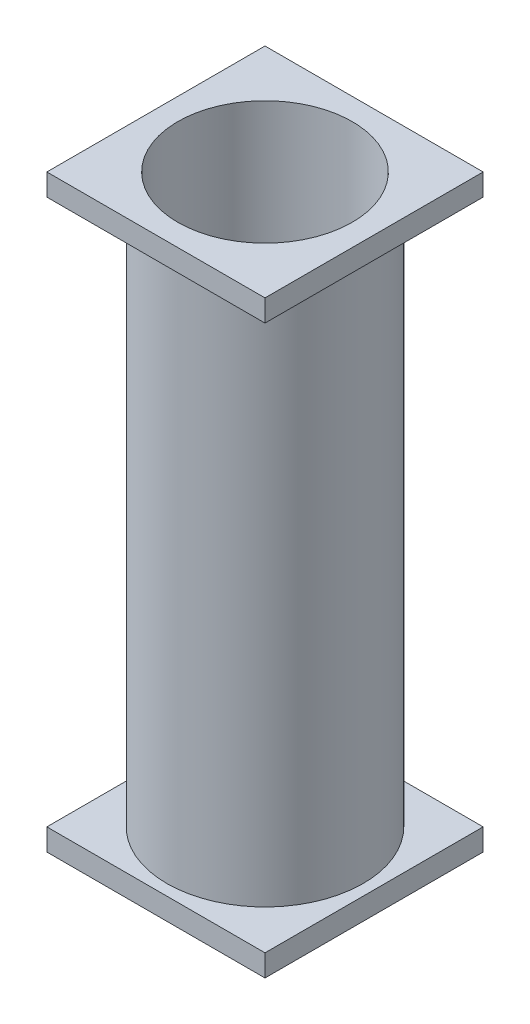
ISO-10303-21;
HEADER;
FILE_DESCRIPTION(('STEP AP214'),'2;1');
FILE_NAME('part.step','',(''),(''),'','','');
FILE_SCHEMA(('AUTOMOTIVE_DESIGN { 1 0 10303 214 1 1 1 1 }'));
ENDSEC;
DATA;
#1=APPLICATION_CONTEXT('core data for automotive mechanical design processes');
#2=APPLICATION_PROTOCOL_DEFINITION('international standard','automotive_design',2000,#1);
#3=PRODUCT_CONTEXT('',#1,'mechanical');
#4=PRODUCT('Part','Part','',(#3));
#5=PRODUCT_RELATED_PRODUCT_CATEGORY('part','',(#4));
#6=PRODUCT_DEFINITION_FORMATION('','',#4);
#7=PRODUCT_DEFINITION_CONTEXT('part definition',#1,'design');
#8=PRODUCT_DEFINITION('design','',#6,#7);
#9=PRODUCT_DEFINITION_SHAPE('','',#8);
#10=(LENGTH_UNIT() NAMED_UNIT(*) SI_UNIT(.MILLI.,.METRE.));
#11=(NAMED_UNIT(*) PLANE_ANGLE_UNIT() SI_UNIT($,.RADIAN.));
#12=(NAMED_UNIT(*) SI_UNIT($,.STERADIAN.) SOLID_ANGLE_UNIT());
#13=UNCERTAINTY_MEASURE_WITH_UNIT(LENGTH_MEASURE(1.E-05),#10,'distance_accuracy_value','');
#14=(GEOMETRIC_REPRESENTATION_CONTEXT(3) GLOBAL_UNCERTAINTY_ASSIGNED_CONTEXT((#13)) GLOBAL_UNIT_ASSIGNED_CONTEXT((#10,
#11,#12)) REPRESENTATION_CONTEXT('',''));
#15=CARTESIAN_POINT('',(0.,0.,0.));
#16=DIRECTION('',(0.,0.,1.));
#17=DIRECTION('',(1.,0.,0.));
#18=AXIS2_PLACEMENT_3D('',#15,#16,#17);
#19=CARTESIAN_POINT('',(0.,2.,0.));
#20=DIRECTION('',(0.,1.,0.));
#21=DIRECTION('',(0.,0.,1.));
#22=AXIS2_PLACEMENT_3D('',#19,#20,#21);
#23=PLANE('',#22);
#24=CARTESIAN_POINT('',(-10.,2.,-10.));
#25=DIRECTION('',(0.,1.,0.));
#26=DIRECTION('',(0.,0.,1.));
#27=AXIS2_PLACEMENT_3D('',#24,#25,#26);
#28=CIRCLE('',#27,9.);
#29=CARTESIAN_POINT('',(-10.,2.,-0.999999999999999));
#30=VERTEX_POINT('',#29);
#31=EDGE_CURVE('E147',#30,#30,#28,.T.);
#32=ORIENTED_EDGE('',*,*,#31,.F.);
#33=EDGE_LOOP('',(#32));
#34=FACE_BOUND('',#33,.T.);
#35=DIRECTION('',(0.,0.,-1.));
#36=VECTOR('',#35,1.);
#37=CARTESIAN_POINT('',(0.,2.,0.));
#38=LINE('',#37,#36);
#39=CARTESIAN_POINT('',(0.,2.,0.));
#40=VERTEX_POINT('',#39);
#41=CARTESIAN_POINT('',(0.,2.,-20.));
#42=VERTEX_POINT('',#41);
#43=EDGE_CURVE('E166',#40,#42,#38,.T.);
#44=ORIENTED_EDGE('',*,*,#43,.T.);
#45=DIRECTION('',(-1.,0.,0.));
#46=VECTOR('',#45,1.);
#47=CARTESIAN_POINT('',(0.,2.,-20.));
#48=LINE('',#47,#46);
#49=CARTESIAN_POINT('',(-20.,2.,-20.));
#50=VERTEX_POINT('',#49);
#51=EDGE_CURVE('E91',#42,#50,#48,.T.);
#52=ORIENTED_EDGE('',*,*,#51,.T.);
#53=DIRECTION('',(0.,0.,1.));
#54=VECTOR('',#53,1.);
#55=CARTESIAN_POINT('',(-20.,2.,0.));
#56=LINE('',#55,#54);
#57=CARTESIAN_POINT('',(-20.,2.,0.));
#58=VERTEX_POINT('',#57);
#59=EDGE_CURVE('E171',#50,#58,#56,.T.);
#60=ORIENTED_EDGE('',*,*,#59,.T.);
#61=DIRECTION('',(1.,0.,0.));
#62=VECTOR('',#61,1.);
#63=CARTESIAN_POINT('',(0.,2.,0.));
#64=LINE('',#63,#62);
#65=EDGE_CURVE('E60',#58,#40,#64,.T.);
#66=ORIENTED_EDGE('',*,*,#65,.T.);
#67=EDGE_LOOP('',(#44,#52,#60,#66));
#68=FACE_BOUND('',#67,.T.);
#69=ADVANCED_FACE('F42',(#34,#68),#23,.T.);
#70=CARTESIAN_POINT('',(0.,0.,0.));
#71=DIRECTION('',(0.,1.,0.));
#72=DIRECTION('',(0.,0.,1.));
#73=AXIS2_PLACEMENT_3D('',#70,#71,#72);
#74=PLANE('',#73);
#75=DIRECTION('',(0.,0.,-1.));
#76=VECTOR('',#75,1.);
#77=CARTESIAN_POINT('',(0.,0.,0.));
#78=LINE('',#77,#76);
#79=CARTESIAN_POINT('',(0.,0.,0.));
#80=VERTEX_POINT('',#79);
#81=CARTESIAN_POINT('',(0.,0.,-20.));
#82=VERTEX_POINT('',#81);
#83=EDGE_CURVE('E165',#80,#82,#78,.T.);
#84=ORIENTED_EDGE('',*,*,#83,.F.);
#85=DIRECTION('',(1.,0.,0.));
#86=VECTOR('',#85,1.);
#87=CARTESIAN_POINT('',(0.,0.,0.));
#88=LINE('',#87,#86);
#89=CARTESIAN_POINT('',(-20.,0.,0.));
#90=VERTEX_POINT('',#89);
#91=EDGE_CURVE('E84',#90,#80,#88,.T.);
#92=ORIENTED_EDGE('',*,*,#91,.F.);
#93=DIRECTION('',(0.,0.,1.));
#94=VECTOR('',#93,1.);
#95=CARTESIAN_POINT('',(-20.,0.,0.));
#96=LINE('',#95,#94);
#97=CARTESIAN_POINT('',(-20.,0.,-20.));
#98=VERTEX_POINT('',#97);
#99=EDGE_CURVE('E78',#98,#90,#96,.T.);
#100=ORIENTED_EDGE('',*,*,#99,.F.);
#101=DIRECTION('',(-1.,0.,0.));
#102=VECTOR('',#101,1.);
#103=CARTESIAN_POINT('',(0.,0.,-20.));
#104=LINE('',#103,#102);
#105=EDGE_CURVE('E180',#82,#98,#104,.T.);
#106=ORIENTED_EDGE('',*,*,#105,.F.);
#107=EDGE_LOOP('',(#84,#92,#100,#106));
#108=FACE_BOUND('',#107,.T.);
#109=CARTESIAN_POINT('',(-10.,0.,-10.));
#110=DIRECTION('',(0.,1.,0.));
#111=DIRECTION('',(0.,0.,1.));
#112=AXIS2_PLACEMENT_3D('',#109,#110,#111);
#113=CIRCLE('',#112,8.);
#114=CARTESIAN_POINT('',(-10.,0.,-2.));
#115=VERTEX_POINT('',#114);
#116=EDGE_CURVE('E160',#115,#115,#113,.T.);
#117=ORIENTED_EDGE('',*,*,#116,.T.);
#118=EDGE_LOOP('',(#117));
#119=FACE_BOUND('',#118,.T.);
#120=ADVANCED_FACE('F196',(#108,#119),#74,.F.);
#121=CARTESIAN_POINT('',(0.,2.,0.));
#122=DIRECTION('',(-1.,0.,0.));
#123=DIRECTION('',(0.,0.,1.));
#124=AXIS2_PLACEMENT_3D('',#121,#122,#123);
#125=PLANE('',#124);
#126=ORIENTED_EDGE('',*,*,#83,.T.);
#127=DIRECTION('',(0.,-1.,0.));
#128=VECTOR('',#127,1.);
#129=CARTESIAN_POINT('',(0.,2.,-20.));
#130=LINE('',#129,#128);
#131=EDGE_CURVE('E11',#42,#82,#130,.T.);
#132=ORIENTED_EDGE('',*,*,#131,.F.);
#133=ORIENTED_EDGE('',*,*,#43,.F.);
#134=DIRECTION('',(0.,-1.,0.));
#135=VECTOR('',#134,1.);
#136=CARTESIAN_POINT('',(0.,2.,0.));
#137=LINE('',#136,#135);
#138=EDGE_CURVE('E176',#40,#80,#137,.T.);
#139=ORIENTED_EDGE('',*,*,#138,.T.);
#140=EDGE_LOOP('',(#126,#132,#133,#139));
#141=FACE_BOUND('',#140,.T.);
#142=ADVANCED_FACE('F44',(#141),#125,.F.);
#143=CARTESIAN_POINT('',(0.,2.,-20.));
#144=DIRECTION('',(0.,0.,1.));
#145=DIRECTION('',(1.,0.,0.));
#146=AXIS2_PLACEMENT_3D('',#143,#144,#145);
#147=PLANE('',#146);
#148=ORIENTED_EDGE('',*,*,#105,.T.);
#149=DIRECTION('',(0.,-1.,0.));
#150=VECTOR('',#149,1.);
#151=CARTESIAN_POINT('',(-20.,2.,-20.));
#152=LINE('',#151,#150);
#153=EDGE_CURVE('E52',#50,#98,#152,.T.);
#154=ORIENTED_EDGE('',*,*,#153,.F.);
#155=ORIENTED_EDGE('',*,*,#51,.F.);
#156=ORIENTED_EDGE('',*,*,#131,.T.);
#157=EDGE_LOOP('',(#148,#154,#155,#156));
#158=FACE_BOUND('',#157,.T.);
#159=ADVANCED_FACE('F212',(#158),#147,.F.);
#160=CARTESIAN_POINT('',(-20.,2.,0.));
#161=DIRECTION('',(1.,0.,0.));
#162=DIRECTION('',(0.,0.,-1.));
#163=AXIS2_PLACEMENT_3D('',#160,#161,#162);
#164=PLANE('',#163);
#165=ORIENTED_EDGE('',*,*,#99,.T.);
#166=DIRECTION('',(0.,-1.,0.));
#167=VECTOR('',#166,1.);
#168=CARTESIAN_POINT('',(-20.,2.,0.));
#169=LINE('',#168,#167);
#170=EDGE_CURVE('E189',#58,#90,#169,.T.);
#171=ORIENTED_EDGE('',*,*,#170,.F.);
#172=ORIENTED_EDGE('',*,*,#59,.F.);
#173=ORIENTED_EDGE('',*,*,#153,.T.);
#174=EDGE_LOOP('',(#165,#171,#172,#173));
#175=FACE_BOUND('',#174,.T.);
#176=ADVANCED_FACE('F193',(#175),#164,.F.);
#177=CARTESIAN_POINT('',(0.,2.,0.));
#178=DIRECTION('',(0.,0.,-1.));
#179=DIRECTION('',(-1.,0.,0.));
#180=AXIS2_PLACEMENT_3D('',#177,#178,#179);
#181=PLANE('',#180);
#182=ORIENTED_EDGE('',*,*,#91,.T.);
#183=ORIENTED_EDGE('',*,*,#138,.F.);
#184=ORIENTED_EDGE('',*,*,#65,.F.);
#185=ORIENTED_EDGE('',*,*,#170,.T.);
#186=EDGE_LOOP('',(#182,#183,#184,#185));
#187=FACE_BOUND('',#186,.T.);
#188=ADVANCED_FACE('F201',(#187),#181,.F.);
#189=CARTESIAN_POINT('',(-10.,2.,-10.));
#190=DIRECTION('',(0.,-1.,0.));
#191=DIRECTION('',(0.,0.,-1.));
#192=AXIS2_PLACEMENT_3D('',#189,#190,#191);
#193=CYLINDRICAL_SURFACE('',#192,8.);
#194=ORIENTED_EDGE('',*,*,#116,.F.);
#195=EDGE_LOOP('',(#194));
#196=FACE_BOUND('',#195,.T.);
#197=CARTESIAN_POINT('',(-10.,54.,-10.));
#198=DIRECTION('',(0.,1.,0.));
#199=DIRECTION('',(0.,0.,1.));
#200=AXIS2_PLACEMENT_3D('',#197,#198,#199);
#201=CIRCLE('',#200,8.);
#202=CARTESIAN_POINT('',(-10.,54.,-2.));
#203=VERTEX_POINT('',#202);
#204=EDGE_CURVE('E368',#203,#203,#201,.T.);
#205=ORIENTED_EDGE('',*,*,#204,.T.);
#206=EDGE_LOOP('',(#205));
#207=FACE_BOUND('',#206,.T.);
#208=ADVANCED_FACE('F203',(#196,#207),#193,.F.);
#209=CARTESIAN_POINT('',(-10.,52.,-10.));
#210=DIRECTION('',(0.,-1.,0.));
#211=DIRECTION('',(0.,0.,-1.));
#212=AXIS2_PLACEMENT_3D('',#209,#210,#211);
#213=CYLINDRICAL_SURFACE('',#212,9.);
#214=CARTESIAN_POINT('',(-10.,52.,-10.));
#215=DIRECTION('',(0.,1.,0.));
#216=DIRECTION('',(0.,0.,1.));
#217=AXIS2_PLACEMENT_3D('',#214,#215,#216);
#218=CIRCLE('',#217,9.);
#219=CARTESIAN_POINT('',(-10.,52.,-0.999999999999999));
#220=VERTEX_POINT('',#219);
#221=EDGE_CURVE('E152',#220,#220,#218,.T.);
#222=ORIENTED_EDGE('',*,*,#221,.F.);
#223=EDGE_LOOP('',(#222));
#224=FACE_BOUND('',#223,.T.);
#225=ORIENTED_EDGE('',*,*,#31,.T.);
#226=EDGE_LOOP('',(#225));
#227=FACE_BOUND('',#226,.T.);
#228=ADVANCED_FACE('F209',(#224,#227),#213,.T.);
#229=CARTESIAN_POINT('',(0.,54.,0.));
#230=DIRECTION('',(0.,-1.,0.));
#231=DIRECTION('',(0.,0.,-1.));
#232=AXIS2_PLACEMENT_3D('',#229,#230,#231);
#233=PLANE('',#232);
#234=DIRECTION('',(0.,0.,-1.));
#235=VECTOR('',#234,1.);
#236=CARTESIAN_POINT('',(0.,54.,-20.));
#237=LINE('',#236,#235);
#238=CARTESIAN_POINT('',(0.,54.,0.));
#239=VERTEX_POINT('',#238);
#240=CARTESIAN_POINT('',(0.,54.,-20.));
#241=VERTEX_POINT('',#240);
#242=EDGE_CURVE('E130',#239,#241,#237,.T.);
#243=ORIENTED_EDGE('',*,*,#242,.T.);
#244=DIRECTION('',(-1.,0.,0.));
#245=VECTOR('',#244,1.);
#246=CARTESIAN_POINT('',(0.,54.,-20.));
#247=LINE('',#246,#245);
#248=CARTESIAN_POINT('',(-20.,54.,-20.));
#249=VERTEX_POINT('',#248);
#250=EDGE_CURVE('E118',#241,#249,#247,.T.);
#251=ORIENTED_EDGE('',*,*,#250,.T.);
#252=DIRECTION('',(0.,0.,1.));
#253=VECTOR('',#252,1.);
#254=CARTESIAN_POINT('',(-20.,54.,-20.));
#255=LINE('',#254,#253);
#256=CARTESIAN_POINT('',(-20.,54.,0.));
#257=VERTEX_POINT('',#256);
#258=EDGE_CURVE('E129',#249,#257,#255,.T.);
#259=ORIENTED_EDGE('',*,*,#258,.T.);
#260=DIRECTION('',(1.,0.,0.));
#261=VECTOR('',#260,1.);
#262=CARTESIAN_POINT('',(0.,54.,0.));
#263=LINE('',#262,#261);
#264=EDGE_CURVE('E136',#257,#239,#263,.T.);
#265=ORIENTED_EDGE('',*,*,#264,.T.);
#266=EDGE_LOOP('',(#243,#251,#259,#265));
#267=FACE_BOUND('',#266,.T.);
#268=ORIENTED_EDGE('',*,*,#204,.F.);
#269=EDGE_LOOP('',(#268));
#270=FACE_BOUND('',#269,.T.);
#271=ADVANCED_FACE('F133',(#267,#270),#233,.F.);
#272=CARTESIAN_POINT('',(0.,52.,0.));
#273=DIRECTION('',(0.,-1.,0.));
#274=DIRECTION('',(0.,0.,-1.));
#275=AXIS2_PLACEMENT_3D('',#272,#273,#274);
#276=PLANE('',#275);
#277=ORIENTED_EDGE('',*,*,#221,.T.);
#278=EDGE_LOOP('',(#277));
#279=FACE_BOUND('',#278,.T.);
#280=DIRECTION('',(0.,0.,-1.));
#281=VECTOR('',#280,1.);
#282=CARTESIAN_POINT('',(0.,52.,-20.));
#283=LINE('',#282,#281);
#284=CARTESIAN_POINT('',(0.,52.,0.));
#285=VERTEX_POINT('',#284);
#286=CARTESIAN_POINT('',(0.,52.,-20.));
#287=VERTEX_POINT('',#286);
#288=EDGE_CURVE('E145',#285,#287,#283,.T.);
#289=ORIENTED_EDGE('',*,*,#288,.F.);
#290=DIRECTION('',(1.,0.,0.));
#291=VECTOR('',#290,1.);
#292=CARTESIAN_POINT('',(0.,52.,0.));
#293=LINE('',#292,#291);
#294=CARTESIAN_POINT('',(-20.,52.,0.));
#295=VERTEX_POINT('',#294);
#296=EDGE_CURVE('E141',#295,#285,#293,.T.);
#297=ORIENTED_EDGE('',*,*,#296,.F.);
#298=DIRECTION('',(0.,0.,1.));
#299=VECTOR('',#298,1.);
#300=CARTESIAN_POINT('',(-20.,52.,-20.));
#301=LINE('',#300,#299);
#302=CARTESIAN_POINT('',(-20.,52.,-20.));
#303=VERTEX_POINT('',#302);
#304=EDGE_CURVE('E372',#303,#295,#301,.T.);
#305=ORIENTED_EDGE('',*,*,#304,.F.);
#306=DIRECTION('',(-1.,0.,0.));
#307=VECTOR('',#306,1.);
#308=CARTESIAN_POINT('',(0.,52.,-20.));
#309=LINE('',#308,#307);
#310=EDGE_CURVE('E366',#287,#303,#309,.T.);
#311=ORIENTED_EDGE('',*,*,#310,.F.);
#312=EDGE_LOOP('',(#289,#297,#305,#311));
#313=FACE_BOUND('',#312,.T.);
#314=ADVANCED_FACE('F228',(#279,#313),#276,.T.);
#315=CARTESIAN_POINT('',(0.,54.,-20.));
#316=DIRECTION('',(-1.,0.,0.));
#317=DIRECTION('',(0.,0.,1.));
#318=AXIS2_PLACEMENT_3D('',#315,#316,#317);
#319=PLANE('',#318);
#320=ORIENTED_EDGE('',*,*,#288,.T.);
#321=DIRECTION('',(0.,-1.,0.));
#322=VECTOR('',#321,1.);
#323=CARTESIAN_POINT('',(0.,54.,-20.));
#324=LINE('',#323,#322);
#325=EDGE_CURVE('E122',#241,#287,#324,.T.);
#326=ORIENTED_EDGE('',*,*,#325,.F.);
#327=ORIENTED_EDGE('',*,*,#242,.F.);
#328=DIRECTION('',(0.,-1.,0.));
#329=VECTOR('',#328,1.);
#330=CARTESIAN_POINT('',(0.,54.,0.));
#331=LINE('',#330,#329);
#332=EDGE_CURVE('E383',#239,#285,#331,.T.);
#333=ORIENTED_EDGE('',*,*,#332,.T.);
#334=EDGE_LOOP('',(#320,#326,#327,#333));
#335=FACE_BOUND('',#334,.T.);
#336=ADVANCED_FACE('F143',(#335),#319,.F.);
#337=CARTESIAN_POINT('',(0.,54.,-20.));
#338=DIRECTION('',(0.,0.,1.));
#339=DIRECTION('',(1.,0.,0.));
#340=AXIS2_PLACEMENT_3D('',#337,#338,#339);
#341=PLANE('',#340);
#342=ORIENTED_EDGE('',*,*,#310,.T.);
#343=DIRECTION('',(0.,-1.,0.));
#344=VECTOR('',#343,1.);
#345=CARTESIAN_POINT('',(-20.,54.,-20.));
#346=LINE('',#345,#344);
#347=EDGE_CURVE('E125',#249,#303,#346,.T.);
#348=ORIENTED_EDGE('',*,*,#347,.F.);
#349=ORIENTED_EDGE('',*,*,#250,.F.);
#350=ORIENTED_EDGE('',*,*,#325,.T.);
#351=EDGE_LOOP('',(#342,#348,#349,#350));
#352=FACE_BOUND('',#351,.T.);
#353=ADVANCED_FACE('F120',(#352),#341,.F.);
#354=CARTESIAN_POINT('',(-20.,54.,-20.));
#355=DIRECTION('',(1.,0.,0.));
#356=DIRECTION('',(0.,0.,-1.));
#357=AXIS2_PLACEMENT_3D('',#354,#355,#356);
#358=PLANE('',#357);
#359=ORIENTED_EDGE('',*,*,#304,.T.);
#360=DIRECTION('',(0.,-1.,0.));
#361=VECTOR('',#360,1.);
#362=CARTESIAN_POINT('',(-20.,54.,0.));
#363=LINE('',#362,#361);
#364=EDGE_CURVE('E154',#257,#295,#363,.T.);
#365=ORIENTED_EDGE('',*,*,#364,.F.);
#366=ORIENTED_EDGE('',*,*,#258,.F.);
#367=ORIENTED_EDGE('',*,*,#347,.T.);
#368=EDGE_LOOP('',(#359,#365,#366,#367));
#369=FACE_BOUND('',#368,.T.);
#370=ADVANCED_FACE('F231',(#369),#358,.F.);
#371=CARTESIAN_POINT('',(0.,54.,0.));
#372=DIRECTION('',(0.,0.,-1.));
#373=DIRECTION('',(-1.,0.,0.));
#374=AXIS2_PLACEMENT_3D('',#371,#372,#373);
#375=PLANE('',#374);
#376=ORIENTED_EDGE('',*,*,#296,.T.);
#377=ORIENTED_EDGE('',*,*,#332,.F.);
#378=ORIENTED_EDGE('',*,*,#264,.F.);
#379=ORIENTED_EDGE('',*,*,#364,.T.);
#380=EDGE_LOOP('',(#376,#377,#378,#379));
#381=FACE_BOUND('',#380,.T.);
#382=ADVANCED_FACE('F234',(#381),#375,.F.);
#383=CLOSED_SHELL('',(#69,#120,#142,#159,#176,#188,#208,#228,#271,#314,#336,#353,#370,#382));
#384=MANIFOLD_SOLID_BREP('B2',#383);
#385=ADVANCED_BREP_SHAPE_REPRESENTATION('',(#18,#384),#14);
#386=SHAPE_DEFINITION_REPRESENTATION(#9,#385);
ENDSEC;
END-ISO-10303-21;
